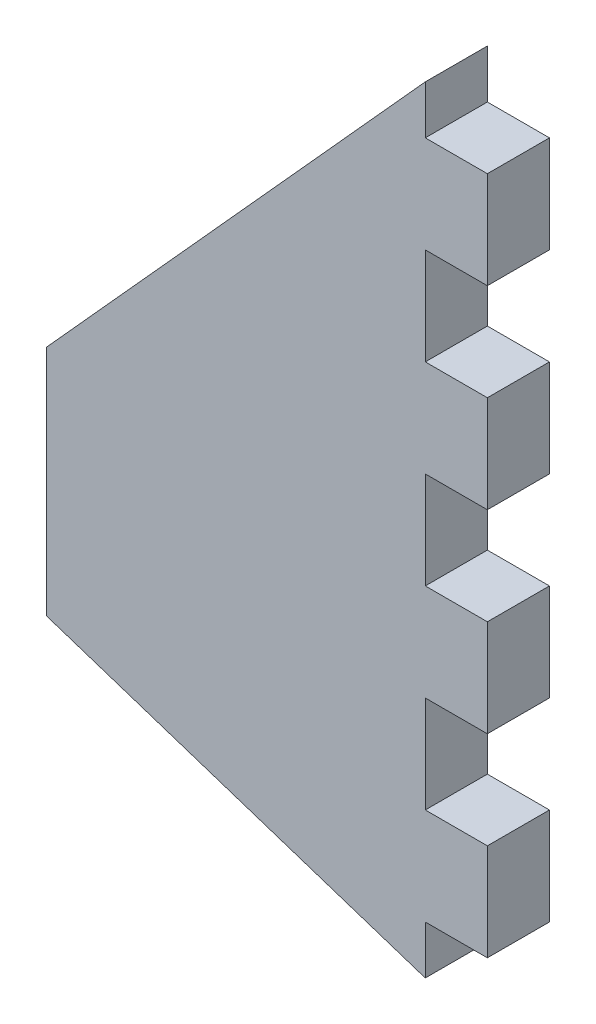
ISO-10303-21;
HEADER;
FILE_DESCRIPTION(('STEP AP214'),'2;1');
FILE_NAME('part.step','',(''),(''),'','','');
FILE_SCHEMA(('AUTOMOTIVE_DESIGN { 1 0 10303 214 1 1 1 1 }'));
ENDSEC;
DATA;
#1=APPLICATION_CONTEXT('core data for automotive mechanical design processes');
#2=APPLICATION_PROTOCOL_DEFINITION('international standard','automotive_design',2000,#1);
#3=PRODUCT_CONTEXT('',#1,'mechanical');
#4=PRODUCT('Part','Part','',(#3));
#5=PRODUCT_RELATED_PRODUCT_CATEGORY('part','',(#4));
#6=PRODUCT_DEFINITION_FORMATION('','',#4);
#7=PRODUCT_DEFINITION_CONTEXT('part definition',#1,'design');
#8=PRODUCT_DEFINITION('design','',#6,#7);
#9=PRODUCT_DEFINITION_SHAPE('','',#8);
#10=(LENGTH_UNIT() NAMED_UNIT(*) SI_UNIT(.MILLI.,.METRE.));
#11=(NAMED_UNIT(*) PLANE_ANGLE_UNIT() SI_UNIT($,.RADIAN.));
#12=(NAMED_UNIT(*) SI_UNIT($,.STERADIAN.) SOLID_ANGLE_UNIT());
#13=UNCERTAINTY_MEASURE_WITH_UNIT(LENGTH_MEASURE(1.E-05),#10,'distance_accuracy_value','');
#14=(GEOMETRIC_REPRESENTATION_CONTEXT(3) GLOBAL_UNCERTAINTY_ASSIGNED_CONTEXT((#13)) GLOBAL_UNIT_ASSIGNED_CONTEXT((#10,
#11,#12)) REPRESENTATION_CONTEXT('',''));
#15=CARTESIAN_POINT('',(0.,0.,0.));
#16=DIRECTION('',(0.,0.,1.));
#17=DIRECTION('',(1.,0.,0.));
#18=AXIS2_PLACEMENT_3D('',#15,#16,#17);
#19=CARTESIAN_POINT('',(0.,0.,4.));
#20=DIRECTION('',(-1.,0.,0.));
#21=DIRECTION('',(0.,0.,1.));
#22=AXIS2_PLACEMENT_3D('',#19,#20,#21);
#23=PLANE('',#22);
#24=DIRECTION('',(0.,1.,0.));
#25=VECTOR('',#24,1.);
#26=CARTESIAN_POINT('',(0.,0.,4.));
#27=LINE('',#26,#25);
#28=CARTESIAN_POINT('',(0.,9.37499999999999,4.));
#29=VERTEX_POINT('',#28);
#30=CARTESIAN_POINT('',(0.,15.625,4.));
#31=VERTEX_POINT('',#30);
#32=EDGE_CURVE('E54',#29,#31,#27,.T.);
#33=ORIENTED_EDGE('',*,*,#32,.F.);
#34=DIRECTION('',(0.,0.,1.));
#35=VECTOR('',#34,1.);
#36=CARTESIAN_POINT('',(0.,9.37499999999999,0.));
#37=LINE('',#36,#35);
#38=CARTESIAN_POINT('',(0.,9.37499999999999,0.));
#39=VERTEX_POINT('',#38);
#40=EDGE_CURVE('E210',#39,#29,#37,.T.);
#41=ORIENTED_EDGE('',*,*,#40,.F.);
#42=DIRECTION('',(0.,1.,0.));
#43=VECTOR('',#42,1.);
#44=CARTESIAN_POINT('',(0.,0.,0.));
#45=LINE('',#44,#43);
#46=CARTESIAN_POINT('',(0.,15.625,0.));
#47=VERTEX_POINT('',#46);
#48=EDGE_CURVE('E316',#39,#47,#45,.T.);
#49=ORIENTED_EDGE('',*,*,#48,.T.);
#50=DIRECTION('',(0.,0.,1.));
#51=VECTOR('',#50,1.);
#52=CARTESIAN_POINT('',(0.,15.625,0.));
#53=LINE('',#52,#51);
#54=EDGE_CURVE('E225',#47,#31,#53,.T.);
#55=ORIENTED_EDGE('',*,*,#54,.T.);
#56=EDGE_LOOP('',(#33,#41,#49,#55));
#57=FACE_BOUND('',#56,.T.);
#58=ADVANCED_FACE('F39',(#57),#23,.F.);
#59=CARTESIAN_POINT('',(0.,21.875,4.));
#60=VERTEX_POINT('',#59);
#61=CARTESIAN_POINT('',(0.,28.125,4.));
#62=VERTEX_POINT('',#61);
#63=EDGE_CURVE('E362',#60,#62,#27,.T.);
#64=ORIENTED_EDGE('',*,*,#63,.F.);
#65=DIRECTION('',(0.,0.,1.));
#66=VECTOR('',#65,1.);
#67=CARTESIAN_POINT('',(0.,21.875,0.));
#68=LINE('',#67,#66);
#69=CARTESIAN_POINT('',(0.,21.875,0.));
#70=VERTEX_POINT('',#69);
#71=EDGE_CURVE('E233',#70,#60,#68,.T.);
#72=ORIENTED_EDGE('',*,*,#71,.F.);
#73=CARTESIAN_POINT('',(0.,28.125,0.));
#74=VERTEX_POINT('',#73);
#75=EDGE_CURVE('E343',#70,#74,#45,.T.);
#76=ORIENTED_EDGE('',*,*,#75,.T.);
#77=DIRECTION('',(0.,0.,1.));
#78=VECTOR('',#77,1.);
#79=CARTESIAN_POINT('',(0.,28.125,0.));
#80=LINE('',#79,#78);
#81=EDGE_CURVE('E252',#74,#62,#80,.T.);
#82=ORIENTED_EDGE('',*,*,#81,.T.);
#83=EDGE_LOOP('',(#64,#72,#76,#82));
#84=FACE_BOUND('',#83,.T.);
#85=ADVANCED_FACE('F375',(#84),#23,.F.);
#86=CARTESIAN_POINT('',(0.,34.375,4.));
#87=VERTEX_POINT('',#86);
#88=CARTESIAN_POINT('',(0.,40.625,4.));
#89=VERTEX_POINT('',#88);
#90=EDGE_CURVE('E363',#87,#89,#27,.T.);
#91=ORIENTED_EDGE('',*,*,#90,.F.);
#92=DIRECTION('',(0.,0.,1.));
#93=VECTOR('',#92,1.);
#94=CARTESIAN_POINT('',(0.,34.375,0.));
#95=LINE('',#94,#93);
#96=CARTESIAN_POINT('',(0.,34.375,0.));
#97=VERTEX_POINT('',#96);
#98=EDGE_CURVE('E260',#97,#87,#95,.T.);
#99=ORIENTED_EDGE('',*,*,#98,.F.);
#100=CARTESIAN_POINT('',(0.,40.625,0.));
#101=VERTEX_POINT('',#100);
#102=EDGE_CURVE('E342',#97,#101,#45,.T.);
#103=ORIENTED_EDGE('',*,*,#102,.T.);
#104=DIRECTION('',(0.,0.,1.));
#105=VECTOR('',#104,1.);
#106=CARTESIAN_POINT('',(0.,40.625,0.));
#107=LINE('',#106,#105);
#108=EDGE_CURVE('E279',#101,#89,#107,.T.);
#109=ORIENTED_EDGE('',*,*,#108,.T.);
#110=EDGE_LOOP('',(#91,#99,#103,#109));
#111=FACE_BOUND('',#110,.T.);
#112=ADVANCED_FACE('F369',(#111),#23,.F.);
#113=DIRECTION('',(0.,0.,1.));
#114=VECTOR('',#113,1.);
#115=CARTESIAN_POINT('',(0.,46.875,0.));
#116=LINE('',#115,#114);
#117=CARTESIAN_POINT('',(0.,46.875,0.));
#118=VERTEX_POINT('',#117);
#119=CARTESIAN_POINT('',(0.,46.875,4.));
#120=VERTEX_POINT('',#119);
#121=EDGE_CURVE('E287',#118,#120,#116,.T.);
#122=ORIENTED_EDGE('',*,*,#121,.F.);
#123=CARTESIAN_POINT('',(0.,50.,0.));
#124=VERTEX_POINT('',#123);
#125=EDGE_CURVE('E314',#118,#124,#45,.T.);
#126=ORIENTED_EDGE('',*,*,#125,.T.);
#127=DIRECTION('',(0.,0.,-1.));
#128=VECTOR('',#127,1.);
#129=CARTESIAN_POINT('',(0.,50.,4.));
#130=LINE('',#129,#128);
#131=CARTESIAN_POINT('',(0.,50.,4.));
#132=VERTEX_POINT('',#131);
#133=EDGE_CURVE('E307',#132,#124,#130,.T.);
#134=ORIENTED_EDGE('',*,*,#133,.F.);
#135=EDGE_CURVE('E304',#120,#132,#27,.T.);
#136=ORIENTED_EDGE('',*,*,#135,.F.);
#137=EDGE_LOOP('',(#122,#126,#134,#136));
#138=FACE_BOUND('',#137,.T.);
#139=ADVANCED_FACE('F367',(#138),#23,.F.);
#140=CARTESIAN_POINT('',(0.,50.,4.));
#141=DIRECTION('',(0.741926249153717,-0.670481499235211,0.));
#142=DIRECTION('',(0.670481499235211,0.741926249153717,0.));
#143=AXIS2_PLACEMENT_3D('',#140,#141,#142);
#144=PLANE('',#143);
#145=DIRECTION('',(-0.670481499235211,-0.741926249153717,0.));
#146=VECTOR('',#145,1.);
#147=CARTESIAN_POINT('',(0.,50.,0.));
#148=LINE('',#147,#146);
#149=CARTESIAN_POINT('',(-24.4,23.,0.));
#150=VERTEX_POINT('',#149);
#151=EDGE_CURVE('E289',#124,#150,#148,.T.);
#152=ORIENTED_EDGE('',*,*,#151,.T.);
#153=DIRECTION('',(0.,0.,-1.));
#154=VECTOR('',#153,1.);
#155=CARTESIAN_POINT('',(-24.4,23.,4.));
#156=LINE('',#155,#154);
#157=CARTESIAN_POINT('',(-24.4,23.,4.));
#158=VERTEX_POINT('',#157);
#159=EDGE_CURVE('E11',#158,#150,#156,.T.);
#160=ORIENTED_EDGE('',*,*,#159,.F.);
#161=DIRECTION('',(-0.670481499235211,-0.741926249153717,0.));
#162=VECTOR('',#161,1.);
#163=CARTESIAN_POINT('',(0.,50.,4.));
#164=LINE('',#163,#162);
#165=EDGE_CURVE('E296',#132,#158,#164,.T.);
#166=ORIENTED_EDGE('',*,*,#165,.F.);
#167=ORIENTED_EDGE('',*,*,#133,.T.);
#168=EDGE_LOOP('',(#152,#160,#166,#167));
#169=FACE_BOUND('',#168,.T.);
#170=ADVANCED_FACE('F41',(#169),#144,.F.);
#171=CARTESIAN_POINT('',(-24.4,23.,4.));
#172=DIRECTION('',(1.,0.,0.));
#173=DIRECTION('',(0.,0.,-1.));
#174=AXIS2_PLACEMENT_3D('',#171,#172,#173);
#175=PLANE('',#174);
#176=DIRECTION('',(0.,-1.,0.));
#177=VECTOR('',#176,1.);
#178=CARTESIAN_POINT('',(-24.4,23.,0.));
#179=LINE('',#178,#177);
#180=CARTESIAN_POINT('',(-24.4,8.,0.));
#181=VERTEX_POINT('',#180);
#182=EDGE_CURVE('E310',#150,#181,#179,.T.);
#183=ORIENTED_EDGE('',*,*,#182,.T.);
#184=DIRECTION('',(0.,0.,-1.));
#185=VECTOR('',#184,1.);
#186=CARTESIAN_POINT('',(-24.4,8.,4.));
#187=LINE('',#186,#185);
#188=CARTESIAN_POINT('',(-24.4,8.,4.));
#189=VERTEX_POINT('',#188);
#190=EDGE_CURVE('E47',#189,#181,#187,.T.);
#191=ORIENTED_EDGE('',*,*,#190,.F.);
#192=DIRECTION('',(0.,-1.,0.));
#193=VECTOR('',#192,1.);
#194=CARTESIAN_POINT('',(-24.4,23.,4.));
#195=LINE('',#194,#193);
#196=EDGE_CURVE('E299',#158,#189,#195,.T.);
#197=ORIENTED_EDGE('',*,*,#196,.F.);
#198=ORIENTED_EDGE('',*,*,#159,.T.);
#199=EDGE_LOOP('',(#183,#191,#197,#198));
#200=FACE_BOUND('',#199,.T.);
#201=ADVANCED_FACE('F334',(#200),#175,.F.);
#202=CARTESIAN_POINT('',(-24.4,8.,4.));
#203=DIRECTION('',(0.311550669171639,0.950229540973498,0.));
#204=DIRECTION('',(-0.950229540973498,0.311550669171639,0.));
#205=AXIS2_PLACEMENT_3D('',#202,#203,#204);
#206=PLANE('',#205);
#207=DIRECTION('',(0.950229540973498,-0.311550669171639,0.));
#208=VECTOR('',#207,1.);
#209=CARTESIAN_POINT('',(-24.4,8.,0.));
#210=LINE('',#209,#208);
#211=CARTESIAN_POINT('',(0.,0.,0.));
#212=VERTEX_POINT('',#211);
#213=EDGE_CURVE('E312',#181,#212,#210,.T.);
#214=ORIENTED_EDGE('',*,*,#213,.T.);
#215=DIRECTION('',(0.,0.,-1.));
#216=VECTOR('',#215,1.);
#217=CARTESIAN_POINT('',(0.,0.,4.));
#218=LINE('',#217,#216);
#219=CARTESIAN_POINT('',(0.,0.,4.));
#220=VERTEX_POINT('',#219);
#221=EDGE_CURVE('E319',#220,#212,#218,.T.);
#222=ORIENTED_EDGE('',*,*,#221,.F.);
#223=DIRECTION('',(0.950229540973498,-0.311550669171639,0.));
#224=VECTOR('',#223,1.);
#225=CARTESIAN_POINT('',(-24.4,8.,4.));
#226=LINE('',#225,#224);
#227=EDGE_CURVE('E302',#189,#220,#226,.T.);
#228=ORIENTED_EDGE('',*,*,#227,.F.);
#229=ORIENTED_EDGE('',*,*,#190,.T.);
#230=EDGE_LOOP('',(#214,#222,#228,#229));
#231=FACE_BOUND('',#230,.T.);
#232=ADVANCED_FACE('F326',(#231),#206,.F.);
#233=CARTESIAN_POINT('',(0.,3.12499999999999,0.));
#234=VERTEX_POINT('',#233);
#235=EDGE_CURVE('E300',#212,#234,#45,.T.);
#236=ORIENTED_EDGE('',*,*,#235,.T.);
#237=DIRECTION('',(0.,0.,1.));
#238=VECTOR('',#237,1.);
#239=CARTESIAN_POINT('',(0.,3.12499999999999,0.));
#240=LINE('',#239,#238);
#241=CARTESIAN_POINT('',(0.,3.12499999999999,4.));
#242=VERTEX_POINT('',#241);
#243=EDGE_CURVE('E62',#234,#242,#240,.T.);
#244=ORIENTED_EDGE('',*,*,#243,.T.);
#245=EDGE_CURVE('E305',#220,#242,#27,.T.);
#246=ORIENTED_EDGE('',*,*,#245,.F.);
#247=ORIENTED_EDGE('',*,*,#221,.T.);
#248=EDGE_LOOP('',(#236,#244,#246,#247));
#249=FACE_BOUND('',#248,.T.);
#250=ADVANCED_FACE('F329',(#249),#23,.F.);
#251=CARTESIAN_POINT('',(0.,0.,4.));
#252=DIRECTION('',(0.,0.,1.));
#253=DIRECTION('',(1.,0.,0.));
#254=AXIS2_PLACEMENT_3D('',#251,#252,#253);
#255=PLANE('',#254);
#256=ORIENTED_EDGE('',*,*,#165,.T.);
#257=ORIENTED_EDGE('',*,*,#196,.T.);
#258=ORIENTED_EDGE('',*,*,#227,.T.);
#259=ORIENTED_EDGE('',*,*,#245,.T.);
#260=DIRECTION('',(1.,0.,0.));
#261=VECTOR('',#260,1.);
#262=CARTESIAN_POINT('',(0.,3.12499999999999,4.));
#263=LINE('',#262,#261);
#264=CARTESIAN_POINT('',(3.99999999999994,3.12499999999999,4.));
#265=VERTEX_POINT('',#264);
#266=EDGE_CURVE('E207',#242,#265,#263,.T.);
#267=ORIENTED_EDGE('',*,*,#266,.T.);
#268=DIRECTION('',(0.,1.,0.));
#269=VECTOR('',#268,1.);
#270=CARTESIAN_POINT('',(3.99999999999994,9.37499999999999,4.));
#271=LINE('',#270,#269);
#272=CARTESIAN_POINT('',(3.99999999999994,9.37499999999999,4.));
#273=VERTEX_POINT('',#272);
#274=EDGE_CURVE('E184',#265,#273,#271,.T.);
#275=ORIENTED_EDGE('',*,*,#274,.T.);
#276=DIRECTION('',(-1.,0.,0.));
#277=VECTOR('',#276,1.);
#278=CARTESIAN_POINT('',(0.,9.37499999999999,4.));
#279=LINE('',#278,#277);
#280=EDGE_CURVE('E201',#273,#29,#279,.T.);
#281=ORIENTED_EDGE('',*,*,#280,.T.);
#282=ORIENTED_EDGE('',*,*,#32,.T.);
#283=DIRECTION('',(1.,0.,0.));
#284=VECTOR('',#283,1.);
#285=CARTESIAN_POINT('',(0.,15.625,4.));
#286=LINE('',#285,#284);
#287=CARTESIAN_POINT('',(3.99999999999996,15.625,4.));
#288=VERTEX_POINT('',#287);
#289=EDGE_CURVE('E212',#31,#288,#286,.T.);
#290=ORIENTED_EDGE('',*,*,#289,.T.);
#291=DIRECTION('',(0.,1.,0.));
#292=VECTOR('',#291,1.);
#293=CARTESIAN_POINT('',(3.99999999999996,21.875,4.));
#294=LINE('',#293,#292);
#295=CARTESIAN_POINT('',(3.99999999999996,21.875,4.));
#296=VERTEX_POINT('',#295);
#297=EDGE_CURVE('E228',#288,#296,#294,.T.);
#298=ORIENTED_EDGE('',*,*,#297,.T.);
#299=DIRECTION('',(-1.,0.,0.));
#300=VECTOR('',#299,1.);
#301=CARTESIAN_POINT('',(0.,21.875,4.));
#302=LINE('',#301,#300);
#303=EDGE_CURVE('E219',#296,#60,#302,.T.);
#304=ORIENTED_EDGE('',*,*,#303,.T.);
#305=ORIENTED_EDGE('',*,*,#63,.T.);
#306=DIRECTION('',(1.,0.,0.));
#307=VECTOR('',#306,1.);
#308=CARTESIAN_POINT('',(0.,28.125,4.));
#309=LINE('',#308,#307);
#310=CARTESIAN_POINT('',(3.99999999999998,28.125,4.));
#311=VERTEX_POINT('',#310);
#312=EDGE_CURVE('E236',#62,#311,#309,.T.);
#313=ORIENTED_EDGE('',*,*,#312,.T.);
#314=DIRECTION('',(0.,1.,0.));
#315=VECTOR('',#314,1.);
#316=CARTESIAN_POINT('',(3.99999999999998,34.375,4.));
#317=LINE('',#316,#315);
#318=CARTESIAN_POINT('',(3.99999999999998,34.375,4.));
#319=VERTEX_POINT('',#318);
#320=EDGE_CURVE('E255',#311,#319,#317,.T.);
#321=ORIENTED_EDGE('',*,*,#320,.T.);
#322=DIRECTION('',(-1.,0.,0.));
#323=VECTOR('',#322,1.);
#324=CARTESIAN_POINT('',(0.,34.375,4.));
#325=LINE('',#324,#323);
#326=EDGE_CURVE('E246',#319,#87,#325,.T.);
#327=ORIENTED_EDGE('',*,*,#326,.T.);
#328=ORIENTED_EDGE('',*,*,#90,.T.);
#329=DIRECTION('',(1.,0.,0.));
#330=VECTOR('',#329,1.);
#331=CARTESIAN_POINT('',(0.,40.625,4.));
#332=LINE('',#331,#330);
#333=CARTESIAN_POINT('',(4.,40.625,4.));
#334=VERTEX_POINT('',#333);
#335=EDGE_CURVE('E263',#89,#334,#332,.T.);
#336=ORIENTED_EDGE('',*,*,#335,.T.);
#337=DIRECTION('',(0.,1.,0.));
#338=VECTOR('',#337,1.);
#339=CARTESIAN_POINT('',(4.,46.875,4.));
#340=LINE('',#339,#338);
#341=CARTESIAN_POINT('',(4.,46.875,4.));
#342=VERTEX_POINT('',#341);
#343=EDGE_CURVE('E282',#334,#342,#340,.T.);
#344=ORIENTED_EDGE('',*,*,#343,.T.);
#345=DIRECTION('',(-1.,0.,0.));
#346=VECTOR('',#345,1.);
#347=CARTESIAN_POINT('',(0.,46.875,4.));
#348=LINE('',#347,#346);
#349=EDGE_CURVE('E274',#342,#120,#348,.T.);
#350=ORIENTED_EDGE('',*,*,#349,.T.);
#351=ORIENTED_EDGE('',*,*,#135,.T.);
#352=EDGE_LOOP('',(#256,#257,#258,#259,#267,#275,#281,#282,#290,#298,#304,#305,#313,#321,#327,
#328,#336,#344,#350,#351));
#353=FACE_BOUND('',#352,.T.);
#354=ADVANCED_FACE('F331',(#353),#255,.T.);
#355=CARTESIAN_POINT('',(0.,0.,0.));
#356=DIRECTION('',(0.,0.,1.));
#357=DIRECTION('',(1.,0.,0.));
#358=AXIS2_PLACEMENT_3D('',#355,#356,#357);
#359=PLANE('',#358);
#360=ORIENTED_EDGE('',*,*,#151,.F.);
#361=ORIENTED_EDGE('',*,*,#125,.F.);
#362=DIRECTION('',(-1.,0.,0.));
#363=VECTOR('',#362,1.);
#364=CARTESIAN_POINT('',(0.,46.875,0.));
#365=LINE('',#364,#363);
#366=CARTESIAN_POINT('',(4.,46.875,0.));
#367=VERTEX_POINT('',#366);
#368=EDGE_CURVE('E277',#367,#118,#365,.T.);
#369=ORIENTED_EDGE('',*,*,#368,.F.);
#370=DIRECTION('',(0.,1.,0.));
#371=VECTOR('',#370,1.);
#372=CARTESIAN_POINT('',(4.,46.875,0.));
#373=LINE('',#372,#371);
#374=CARTESIAN_POINT('',(4.,40.625,0.));
#375=VERTEX_POINT('',#374);
#376=EDGE_CURVE('E273',#375,#367,#373,.T.);
#377=ORIENTED_EDGE('',*,*,#376,.F.);
#378=DIRECTION('',(1.,0.,0.));
#379=VECTOR('',#378,1.);
#380=CARTESIAN_POINT('',(0.,40.625,0.));
#381=LINE('',#380,#379);
#382=EDGE_CURVE('E270',#101,#375,#381,.T.);
#383=ORIENTED_EDGE('',*,*,#382,.F.);
#384=ORIENTED_EDGE('',*,*,#102,.F.);
#385=DIRECTION('',(-1.,0.,0.));
#386=VECTOR('',#385,1.);
#387=CARTESIAN_POINT('',(0.,34.375,0.));
#388=LINE('',#387,#386);
#389=CARTESIAN_POINT('',(3.99999999999998,34.375,0.));
#390=VERTEX_POINT('',#389);
#391=EDGE_CURVE('E249',#390,#97,#388,.T.);
#392=ORIENTED_EDGE('',*,*,#391,.F.);
#393=DIRECTION('',(0.,1.,0.));
#394=VECTOR('',#393,1.);
#395=CARTESIAN_POINT('',(3.99999999999998,34.375,0.));
#396=LINE('',#395,#394);
#397=CARTESIAN_POINT('',(3.99999999999998,28.125,0.));
#398=VERTEX_POINT('',#397);
#399=EDGE_CURVE('E245',#398,#390,#396,.T.);
#400=ORIENTED_EDGE('',*,*,#399,.F.);
#401=DIRECTION('',(1.,0.,0.));
#402=VECTOR('',#401,1.);
#403=CARTESIAN_POINT('',(0.,28.125,0.));
#404=LINE('',#403,#402);
#405=EDGE_CURVE('E242',#74,#398,#404,.T.);
#406=ORIENTED_EDGE('',*,*,#405,.F.);
#407=ORIENTED_EDGE('',*,*,#75,.F.);
#408=DIRECTION('',(-1.,0.,0.));
#409=VECTOR('',#408,1.);
#410=CARTESIAN_POINT('',(0.,21.875,0.));
#411=LINE('',#410,#409);
#412=CARTESIAN_POINT('',(3.99999999999996,21.875,0.));
#413=VERTEX_POINT('',#412);
#414=EDGE_CURVE('E222',#413,#70,#411,.T.);
#415=ORIENTED_EDGE('',*,*,#414,.F.);
#416=DIRECTION('',(0.,1.,0.));
#417=VECTOR('',#416,1.);
#418=CARTESIAN_POINT('',(3.99999999999996,21.875,0.));
#419=LINE('',#418,#417);
#420=CARTESIAN_POINT('',(3.99999999999996,15.625,0.));
#421=VERTEX_POINT('',#420);
#422=EDGE_CURVE('E218',#421,#413,#419,.T.);
#423=ORIENTED_EDGE('',*,*,#422,.F.);
#424=DIRECTION('',(1.,0.,0.));
#425=VECTOR('',#424,1.);
#426=CARTESIAN_POINT('',(0.,15.625,0.));
#427=LINE('',#426,#425);
#428=EDGE_CURVE('E215',#47,#421,#427,.T.);
#429=ORIENTED_EDGE('',*,*,#428,.F.);
#430=ORIENTED_EDGE('',*,*,#48,.F.);
#431=DIRECTION('',(-1.,0.,0.));
#432=VECTOR('',#431,1.);
#433=CARTESIAN_POINT('',(0.,9.37499999999999,0.));
#434=LINE('',#433,#432);
#435=CARTESIAN_POINT('',(3.99999999999994,9.37499999999999,0.));
#436=VERTEX_POINT('',#435);
#437=EDGE_CURVE('E198',#436,#39,#434,.T.);
#438=ORIENTED_EDGE('',*,*,#437,.F.);
#439=DIRECTION('',(0.,1.,0.));
#440=VECTOR('',#439,1.);
#441=CARTESIAN_POINT('',(3.99999999999994,9.37499999999999,0.));
#442=LINE('',#441,#440);
#443=CARTESIAN_POINT('',(3.99999999999994,3.12499999999999,0.));
#444=VERTEX_POINT('',#443);
#445=EDGE_CURVE('E181',#444,#436,#442,.T.);
#446=ORIENTED_EDGE('',*,*,#445,.F.);
#447=DIRECTION('',(1.,0.,0.));
#448=VECTOR('',#447,1.);
#449=CARTESIAN_POINT('',(0.,3.12499999999999,0.));
#450=LINE('',#449,#448);
#451=EDGE_CURVE('E196',#234,#444,#450,.T.);
#452=ORIENTED_EDGE('',*,*,#451,.F.);
#453=ORIENTED_EDGE('',*,*,#235,.F.);
#454=ORIENTED_EDGE('',*,*,#213,.F.);
#455=ORIENTED_EDGE('',*,*,#182,.F.);
#456=EDGE_LOOP('',(#360,#361,#369,#377,#383,#384,#392,#400,#406,#407,#415,#423,#429,#430,#438,
#446,#452,#453,#454,#455));
#457=FACE_BOUND('',#456,.T.);
#458=ADVANCED_FACE('F194',(#457),#359,.F.);
#459=CARTESIAN_POINT('',(0.,46.875,0.));
#460=DIRECTION('',(0.,1.,0.));
#461=DIRECTION('',(-1.,0.,0.));
#462=AXIS2_PLACEMENT_3D('',#459,#460,#461);
#463=PLANE('',#462);
#464=ORIENTED_EDGE('',*,*,#349,.F.);
#465=DIRECTION('',(0.,0.,1.));
#466=VECTOR('',#465,1.);
#467=CARTESIAN_POINT('',(4.,46.875,0.));
#468=LINE('',#467,#466);
#469=EDGE_CURVE('E290',#367,#342,#468,.T.);
#470=ORIENTED_EDGE('',*,*,#469,.F.);
#471=ORIENTED_EDGE('',*,*,#368,.T.);
#472=ORIENTED_EDGE('',*,*,#121,.T.);
#473=EDGE_LOOP('',(#464,#470,#471,#472));
#474=FACE_BOUND('',#473,.T.);
#475=ADVANCED_FACE('F413',(#474),#463,.T.);
#476=CARTESIAN_POINT('',(4.,46.875,0.));
#477=DIRECTION('',(1.,0.,0.));
#478=DIRECTION('',(0.,1.,0.));
#479=AXIS2_PLACEMENT_3D('',#476,#477,#478);
#480=PLANE('',#479);
#481=ORIENTED_EDGE('',*,*,#343,.F.);
#482=DIRECTION('',(0.,0.,1.));
#483=VECTOR('',#482,1.);
#484=CARTESIAN_POINT('',(4.,40.625,0.));
#485=LINE('',#484,#483);
#486=EDGE_CURVE('E292',#375,#334,#485,.T.);
#487=ORIENTED_EDGE('',*,*,#486,.F.);
#488=ORIENTED_EDGE('',*,*,#376,.T.);
#489=ORIENTED_EDGE('',*,*,#469,.T.);
#490=EDGE_LOOP('',(#481,#487,#488,#489));
#491=FACE_BOUND('',#490,.T.);
#492=ADVANCED_FACE('F416',(#491),#480,.T.);
#493=CARTESIAN_POINT('',(0.,40.625,0.));
#494=DIRECTION('',(0.,-1.,0.));
#495=DIRECTION('',(0.,0.,-1.));
#496=AXIS2_PLACEMENT_3D('',#493,#494,#495);
#497=PLANE('',#496);
#498=ORIENTED_EDGE('',*,*,#335,.F.);
#499=ORIENTED_EDGE('',*,*,#108,.F.);
#500=ORIENTED_EDGE('',*,*,#382,.T.);
#501=ORIENTED_EDGE('',*,*,#486,.T.);
#502=EDGE_LOOP('',(#498,#499,#500,#501));
#503=FACE_BOUND('',#502,.T.);
#504=ADVANCED_FACE('F408',(#503),#497,.T.);
#505=CARTESIAN_POINT('',(0.,34.375,0.));
#506=DIRECTION('',(0.,1.,0.));
#507=DIRECTION('',(-1.,0.,0.));
#508=AXIS2_PLACEMENT_3D('',#505,#506,#507);
#509=PLANE('',#508);
#510=ORIENTED_EDGE('',*,*,#326,.F.);
#511=DIRECTION('',(0.,0.,1.));
#512=VECTOR('',#511,1.);
#513=CARTESIAN_POINT('',(3.99999999999998,34.375,0.));
#514=LINE('',#513,#512);
#515=EDGE_CURVE('E264',#390,#319,#514,.T.);
#516=ORIENTED_EDGE('',*,*,#515,.F.);
#517=ORIENTED_EDGE('',*,*,#391,.T.);
#518=ORIENTED_EDGE('',*,*,#98,.T.);
#519=EDGE_LOOP('',(#510,#516,#517,#518));
#520=FACE_BOUND('',#519,.T.);
#521=ADVANCED_FACE('F405',(#520),#509,.T.);
#522=CARTESIAN_POINT('',(3.99999999999998,34.375,0.));
#523=DIRECTION('',(1.,0.,0.));
#524=DIRECTION('',(0.,1.,0.));
#525=AXIS2_PLACEMENT_3D('',#522,#523,#524);
#526=PLANE('',#525);
#527=ORIENTED_EDGE('',*,*,#320,.F.);
#528=DIRECTION('',(0.,0.,1.));
#529=VECTOR('',#528,1.);
#530=CARTESIAN_POINT('',(3.99999999999998,28.125,0.));
#531=LINE('',#530,#529);
#532=EDGE_CURVE('E266',#398,#311,#531,.T.);
#533=ORIENTED_EDGE('',*,*,#532,.F.);
#534=ORIENTED_EDGE('',*,*,#399,.T.);
#535=ORIENTED_EDGE('',*,*,#515,.T.);
#536=EDGE_LOOP('',(#527,#533,#534,#535));
#537=FACE_BOUND('',#536,.T.);
#538=ADVANCED_FACE('F396',(#537),#526,.T.);
#539=CARTESIAN_POINT('',(0.,28.125,0.));
#540=DIRECTION('',(0.,-1.,0.));
#541=DIRECTION('',(0.,0.,-1.));
#542=AXIS2_PLACEMENT_3D('',#539,#540,#541);
#543=PLANE('',#542);
#544=ORIENTED_EDGE('',*,*,#312,.F.);
#545=ORIENTED_EDGE('',*,*,#81,.F.);
#546=ORIENTED_EDGE('',*,*,#405,.T.);
#547=ORIENTED_EDGE('',*,*,#532,.T.);
#548=EDGE_LOOP('',(#544,#545,#546,#547));
#549=FACE_BOUND('',#548,.T.);
#550=ADVANCED_FACE('F389',(#549),#543,.T.);
#551=CARTESIAN_POINT('',(0.,21.875,0.));
#552=DIRECTION('',(0.,1.,0.));
#553=DIRECTION('',(-1.,0.,0.));
#554=AXIS2_PLACEMENT_3D('',#551,#552,#553);
#555=PLANE('',#554);
#556=ORIENTED_EDGE('',*,*,#303,.F.);
#557=DIRECTION('',(0.,0.,1.));
#558=VECTOR('',#557,1.);
#559=CARTESIAN_POINT('',(3.99999999999996,21.875,0.));
#560=LINE('',#559,#558);
#561=EDGE_CURVE('E237',#413,#296,#560,.T.);
#562=ORIENTED_EDGE('',*,*,#561,.F.);
#563=ORIENTED_EDGE('',*,*,#414,.T.);
#564=ORIENTED_EDGE('',*,*,#71,.T.);
#565=EDGE_LOOP('',(#556,#562,#563,#564));
#566=FACE_BOUND('',#565,.T.);
#567=ADVANCED_FACE('F387',(#566),#555,.T.);
#568=CARTESIAN_POINT('',(3.99999999999996,21.875,0.));
#569=DIRECTION('',(1.,0.,0.));
#570=DIRECTION('',(0.,1.,0.));
#571=AXIS2_PLACEMENT_3D('',#568,#569,#570);
#572=PLANE('',#571);
#573=ORIENTED_EDGE('',*,*,#297,.F.);
#574=DIRECTION('',(0.,0.,1.));
#575=VECTOR('',#574,1.);
#576=CARTESIAN_POINT('',(3.99999999999996,15.625,0.));
#577=LINE('',#576,#575);
#578=EDGE_CURVE('E239',#421,#288,#577,.T.);
#579=ORIENTED_EDGE('',*,*,#578,.F.);
#580=ORIENTED_EDGE('',*,*,#422,.T.);
#581=ORIENTED_EDGE('',*,*,#561,.T.);
#582=EDGE_LOOP('',(#573,#579,#580,#581));
#583=FACE_BOUND('',#582,.T.);
#584=ADVANCED_FACE('F359',(#583),#572,.T.);
#585=CARTESIAN_POINT('',(0.,15.625,0.));
#586=DIRECTION('',(0.,-1.,0.));
#587=DIRECTION('',(0.,0.,-1.));
#588=AXIS2_PLACEMENT_3D('',#585,#586,#587);
#589=PLANE('',#588);
#590=ORIENTED_EDGE('',*,*,#289,.F.);
#591=ORIENTED_EDGE('',*,*,#54,.F.);
#592=ORIENTED_EDGE('',*,*,#428,.T.);
#593=ORIENTED_EDGE('',*,*,#578,.T.);
#594=EDGE_LOOP('',(#590,#591,#592,#593));
#595=FACE_BOUND('',#594,.T.);
#596=ADVANCED_FACE('F354',(#595),#589,.T.);
#597=CARTESIAN_POINT('',(0.,9.37499999999999,0.));
#598=DIRECTION('',(0.,1.,0.));
#599=DIRECTION('',(-1.,0.,0.));
#600=AXIS2_PLACEMENT_3D('',#597,#598,#599);
#601=PLANE('',#600);
#602=ORIENTED_EDGE('',*,*,#280,.F.);
#603=DIRECTION('',(0.,0.,1.));
#604=VECTOR('',#603,1.);
#605=CARTESIAN_POINT('',(3.99999999999994,9.37499999999999,0.));
#606=LINE('',#605,#604);
#607=EDGE_CURVE('E189',#436,#273,#606,.T.);
#608=ORIENTED_EDGE('',*,*,#607,.F.);
#609=ORIENTED_EDGE('',*,*,#437,.T.);
#610=ORIENTED_EDGE('',*,*,#40,.T.);
#611=EDGE_LOOP('',(#602,#608,#609,#610));
#612=FACE_BOUND('',#611,.T.);
#613=ADVANCED_FACE('F404',(#612),#601,.T.);
#614=CARTESIAN_POINT('',(3.99999999999994,9.37499999999999,0.));
#615=DIRECTION('',(1.,0.,0.));
#616=DIRECTION('',(0.,1.,0.));
#617=AXIS2_PLACEMENT_3D('',#614,#615,#616);
#618=PLANE('',#617);
#619=ORIENTED_EDGE('',*,*,#274,.F.);
#620=DIRECTION('',(0.,0.,1.));
#621=VECTOR('',#620,1.);
#622=CARTESIAN_POINT('',(3.99999999999994,3.12499999999999,0.));
#623=LINE('',#622,#621);
#624=EDGE_CURVE('E178',#444,#265,#623,.T.);
#625=ORIENTED_EDGE('',*,*,#624,.F.);
#626=ORIENTED_EDGE('',*,*,#445,.T.);
#627=ORIENTED_EDGE('',*,*,#607,.T.);
#628=EDGE_LOOP('',(#619,#625,#626,#627));
#629=FACE_BOUND('',#628,.T.);
#630=ADVANCED_FACE('F180',(#629),#618,.T.);
#631=CARTESIAN_POINT('',(0.,3.12499999999999,0.));
#632=DIRECTION('',(0.,-1.,0.));
#633=DIRECTION('',(0.,0.,-1.));
#634=AXIS2_PLACEMENT_3D('',#631,#632,#633);
#635=PLANE('',#634);
#636=ORIENTED_EDGE('',*,*,#266,.F.);
#637=ORIENTED_EDGE('',*,*,#243,.F.);
#638=ORIENTED_EDGE('',*,*,#451,.T.);
#639=ORIENTED_EDGE('',*,*,#624,.T.);
#640=EDGE_LOOP('',(#636,#637,#638,#639));
#641=FACE_BOUND('',#640,.T.);
#642=ADVANCED_FACE('F200',(#641),#635,.T.);
#643=CLOSED_SHELL('',(#58,#85,#112,#139,#170,#201,#232,#250,#354,#458,#475,#492,#504,#521,#538,
#550,#567,#584,#596,#613,#630,#642));
#644=MANIFOLD_SOLID_BREP('B2',#643);
#645=ADVANCED_BREP_SHAPE_REPRESENTATION('',(#18,#644),#14);
#646=SHAPE_DEFINITION_REPRESENTATION(#9,#645);
ENDSEC;
END-ISO-10303-21;
